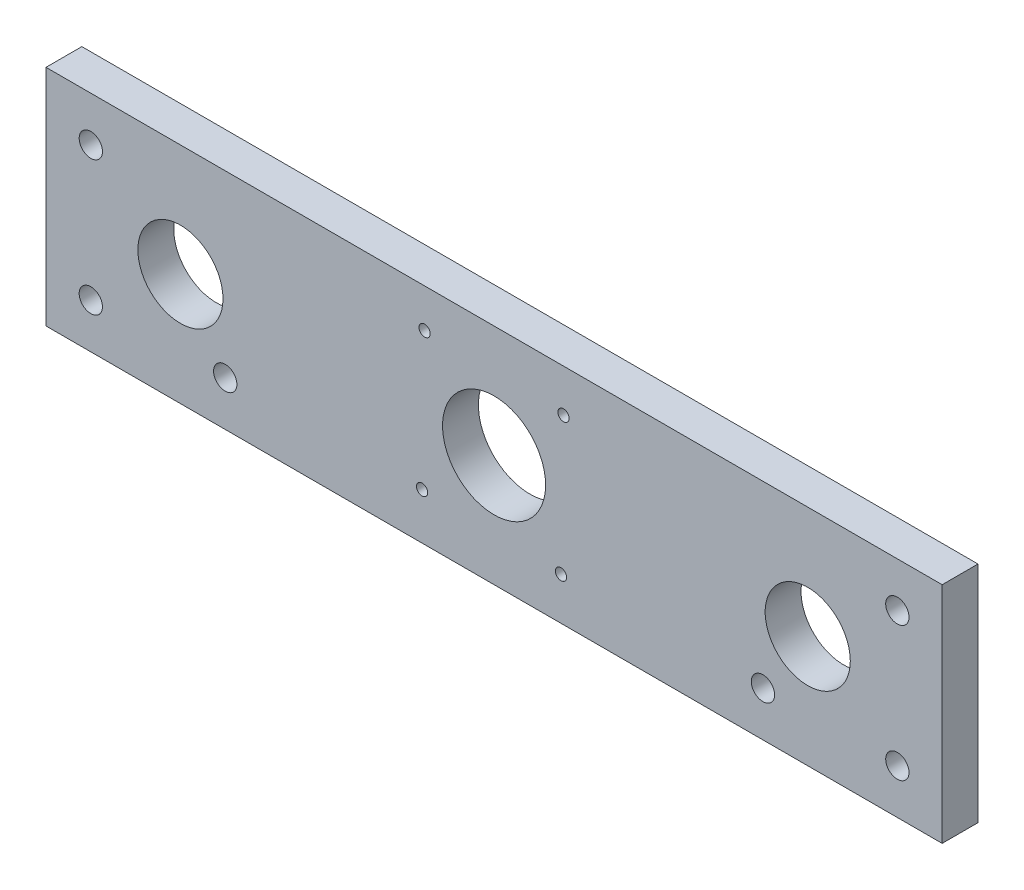
ISO-10303-21;
HEADER;
FILE_DESCRIPTION(('STEP AP214'),'2;1');
FILE_NAME('part.step','',(''),(''),'','','');
FILE_SCHEMA(('AUTOMOTIVE_DESIGN { 1 0 10303 214 1 1 1 1 }'));
ENDSEC;
DATA;
#1=APPLICATION_CONTEXT('core data for automotive mechanical design processes');
#2=APPLICATION_PROTOCOL_DEFINITION('international standard','automotive_design',2000,#1);
#3=PRODUCT_CONTEXT('',#1,'mechanical');
#4=PRODUCT('Part','Part','',(#3));
#5=PRODUCT_RELATED_PRODUCT_CATEGORY('part','',(#4));
#6=PRODUCT_DEFINITION_FORMATION('','',#4);
#7=PRODUCT_DEFINITION_CONTEXT('part definition',#1,'design');
#8=PRODUCT_DEFINITION('design','',#6,#7);
#9=PRODUCT_DEFINITION_SHAPE('','',#8);
#10=(LENGTH_UNIT() NAMED_UNIT(*) SI_UNIT(.MILLI.,.METRE.));
#11=(NAMED_UNIT(*) PLANE_ANGLE_UNIT() SI_UNIT($,.RADIAN.));
#12=(NAMED_UNIT(*) SI_UNIT($,.STERADIAN.) SOLID_ANGLE_UNIT());
#13=UNCERTAINTY_MEASURE_WITH_UNIT(LENGTH_MEASURE(1.E-05),#10,'distance_accuracy_value','');
#14=(GEOMETRIC_REPRESENTATION_CONTEXT(3) GLOBAL_UNCERTAINTY_ASSIGNED_CONTEXT((#13)) GLOBAL_UNIT_ASSIGNED_CONTEXT((#10,
#11,#12)) REPRESENTATION_CONTEXT('',''));
#15=CARTESIAN_POINT('',(0.,0.,0.));
#16=DIRECTION('',(0.,0.,1.));
#17=DIRECTION('',(1.,0.,0.));
#18=AXIS2_PLACEMENT_3D('',#15,#16,#17);
#19=CARTESIAN_POINT('',(0.,-1.68869309838472,8.));
#20=DIRECTION('',(0.,1.,0.));
#21=DIRECTION('',(0.,0.,1.));
#22=AXIS2_PLACEMENT_3D('',#19,#20,#21);
#23=PLANE('',#22);
#24=DIRECTION('',(1.,0.,0.));
#25=VECTOR('',#24,1.);
#26=CARTESIAN_POINT('',(0.,-1.68869309838472,0.));
#27=LINE('',#26,#25);
#28=CARTESIAN_POINT('',(-58.1497797356829,-1.68869309838472,0.));
#29=VERTEX_POINT('',#28);
#30=CARTESIAN_POINT('',(141.850220264317,-1.68869309838472,0.));
#31=VERTEX_POINT('',#30);
#32=EDGE_CURVE('E198',#29,#31,#27,.T.);
#33=ORIENTED_EDGE('',*,*,#32,.F.);
#34=DIRECTION('',(0.,0.,-1.));
#35=VECTOR('',#34,1.);
#36=CARTESIAN_POINT('',(-58.1497797356829,-1.68869309838472,8.));
#37=LINE('',#36,#35);
#38=CARTESIAN_POINT('',(-58.1497797356829,-1.68869309838472,8.));
#39=VERTEX_POINT('',#38);
#40=EDGE_CURVE('E11',#39,#29,#37,.T.);
#41=ORIENTED_EDGE('',*,*,#40,.F.);
#42=DIRECTION('',(1.,0.,0.));
#43=VECTOR('',#42,1.);
#44=CARTESIAN_POINT('',(0.,-1.68869309838472,8.));
#45=LINE('',#44,#43);
#46=CARTESIAN_POINT('',(141.850220264317,-1.68869309838472,8.));
#47=VERTEX_POINT('',#46);
#48=EDGE_CURVE('E100',#39,#47,#45,.T.);
#49=ORIENTED_EDGE('',*,*,#48,.T.);
#50=DIRECTION('',(0.,0.,-1.));
#51=VECTOR('',#50,1.);
#52=CARTESIAN_POINT('',(141.850220264317,-1.68869309838472,8.));
#53=LINE('',#52,#51);
#54=EDGE_CURVE('E60',#47,#31,#53,.T.);
#55=ORIENTED_EDGE('',*,*,#54,.T.);
#56=EDGE_LOOP('',(#33,#41,#49,#55));
#57=FACE_BOUND('',#56,.T.);
#58=ADVANCED_FACE('F40',(#57),#23,.T.);
#59=CARTESIAN_POINT('',(-58.1497797356829,0.,8.));
#60=DIRECTION('',(1.,0.,0.));
#61=DIRECTION('',(0.,1.,0.));
#62=AXIS2_PLACEMENT_3D('',#59,#60,#61);
#63=PLANE('',#62);
#64=DIRECTION('',(0.,-1.,0.));
#65=VECTOR('',#64,1.);
#66=CARTESIAN_POINT('',(-58.1497797356829,0.,0.));
#67=LINE('',#66,#65);
#68=CARTESIAN_POINT('',(-58.1497797356828,-51.6886930983847,0.));
#69=VERTEX_POINT('',#68);
#70=EDGE_CURVE('E106',#29,#69,#67,.T.);
#71=ORIENTED_EDGE('',*,*,#70,.T.);
#72=DIRECTION('',(0.,0.,-1.));
#73=VECTOR('',#72,1.);
#74=CARTESIAN_POINT('',(-58.1497797356828,-51.6886930983847,8.));
#75=LINE('',#74,#73);
#76=CARTESIAN_POINT('',(-58.1497797356828,-51.6886930983847,8.));
#77=VERTEX_POINT('',#76);
#78=EDGE_CURVE('E51',#77,#69,#75,.T.);
#79=ORIENTED_EDGE('',*,*,#78,.F.);
#80=DIRECTION('',(0.,-1.,0.));
#81=VECTOR('',#80,1.);
#82=CARTESIAN_POINT('',(-58.1497797356829,0.,8.));
#83=LINE('',#82,#81);
#84=EDGE_CURVE('E95',#39,#77,#83,.T.);
#85=ORIENTED_EDGE('',*,*,#84,.F.);
#86=ORIENTED_EDGE('',*,*,#40,.T.);
#87=EDGE_LOOP('',(#71,#79,#85,#86));
#88=FACE_BOUND('',#87,.T.);
#89=ADVANCED_FACE('F104',(#88),#63,.F.);
#90=CARTESIAN_POINT('',(0.,-51.6886930983847,8.));
#91=DIRECTION('',(0.,1.,0.));
#92=DIRECTION('',(0.,0.,1.));
#93=AXIS2_PLACEMENT_3D('',#90,#91,#92);
#94=PLANE('',#93);
#95=DIRECTION('',(1.,0.,0.));
#96=VECTOR('',#95,1.);
#97=CARTESIAN_POINT('',(0.,-51.6886930983847,0.));
#98=LINE('',#97,#96);
#99=CARTESIAN_POINT('',(141.850220264317,-51.6886930983847,0.));
#100=VERTEX_POINT('',#99);
#101=EDGE_CURVE('E203',#69,#100,#98,.T.);
#102=ORIENTED_EDGE('',*,*,#101,.T.);
#103=DIRECTION('',(0.,0.,-1.));
#104=VECTOR('',#103,1.);
#105=CARTESIAN_POINT('',(141.850220264317,-51.6886930983847,8.));
#106=LINE('',#105,#104);
#107=CARTESIAN_POINT('',(141.850220264317,-51.6886930983847,8.));
#108=VERTEX_POINT('',#107);
#109=EDGE_CURVE('E74',#108,#100,#106,.T.);
#110=ORIENTED_EDGE('',*,*,#109,.F.);
#111=DIRECTION('',(1.,0.,0.));
#112=VECTOR('',#111,1.);
#113=CARTESIAN_POINT('',(0.,-51.6886930983847,8.));
#114=LINE('',#113,#112);
#115=EDGE_CURVE('E86',#77,#108,#114,.T.);
#116=ORIENTED_EDGE('',*,*,#115,.F.);
#117=ORIENTED_EDGE('',*,*,#78,.T.);
#118=EDGE_LOOP('',(#102,#110,#116,#117));
#119=FACE_BOUND('',#118,.T.);
#120=ADVANCED_FACE('F88',(#119),#94,.F.);
#121=CARTESIAN_POINT('',(141.850220264317,0.,8.));
#122=DIRECTION('',(1.,0.,0.));
#123=DIRECTION('',(0.,0.,-1.));
#124=AXIS2_PLACEMENT_3D('',#121,#122,#123);
#125=PLANE('',#124);
#126=DIRECTION('',(0.,-1.,0.));
#127=VECTOR('',#126,1.);
#128=CARTESIAN_POINT('',(141.850220264317,0.,0.));
#129=LINE('',#128,#127);
#130=EDGE_CURVE('E206',#31,#100,#129,.T.);
#131=ORIENTED_EDGE('',*,*,#130,.F.);
#132=ORIENTED_EDGE('',*,*,#54,.F.);
#133=DIRECTION('',(0.,-1.,0.));
#134=VECTOR('',#133,1.);
#135=CARTESIAN_POINT('',(141.850220264317,0.,8.));
#136=LINE('',#135,#134);
#137=EDGE_CURVE('E94',#47,#108,#136,.T.);
#138=ORIENTED_EDGE('',*,*,#137,.T.);
#139=ORIENTED_EDGE('',*,*,#109,.T.);
#140=EDGE_LOOP('',(#131,#132,#138,#139));
#141=FACE_BOUND('',#140,.T.);
#142=ADVANCED_FACE('F256',(#141),#125,.T.);
#143=CARTESIAN_POINT('',(111.850220264317,-26.6886930983847,8.));
#144=DIRECTION('',(0.,0.,-1.));
#145=DIRECTION('',(-1.,0.,0.));
#146=AXIS2_PLACEMENT_3D('',#143,#144,#145);
#147=CYLINDRICAL_SURFACE('',#146,9.49999999999999);
#148=CARTESIAN_POINT('',(111.850220264317,-26.6886930983847,8.));
#149=DIRECTION('',(0.,0.,1.));
#150=DIRECTION('',(1.,0.,0.));
#151=AXIS2_PLACEMENT_3D('',#148,#149,#150);
#152=CIRCLE('',#151,9.49999999999999);
#153=CARTESIAN_POINT('',(121.350220264317,-26.6886930983847,8.));
#154=VERTEX_POINT('',#153);
#155=EDGE_CURVE('E182',#154,#154,#152,.T.);
#156=ORIENTED_EDGE('',*,*,#155,.T.);
#157=EDGE_LOOP('',(#156));
#158=FACE_BOUND('',#157,.T.);
#159=CARTESIAN_POINT('',(111.850220264317,-26.6886930983847,0.));
#160=DIRECTION('',(0.,0.,1.));
#161=DIRECTION('',(1.,0.,0.));
#162=AXIS2_PLACEMENT_3D('',#159,#160,#161);
#163=CIRCLE('',#162,9.49999999999999);
#164=CARTESIAN_POINT('',(121.350220264317,-26.6886930983847,0.));
#165=VERTEX_POINT('',#164);
#166=EDGE_CURVE('E181',#165,#165,#163,.T.);
#167=ORIENTED_EDGE('',*,*,#166,.F.);
#168=EDGE_LOOP('',(#167));
#169=FACE_BOUND('',#168,.T.);
#170=ADVANCED_FACE('F42',(#158,#169),#147,.F.);
#171=CARTESIAN_POINT('',(-28.1497797356829,-26.6886930983847,8.));
#172=DIRECTION('',(0.,0.,-1.));
#173=DIRECTION('',(-1.,0.,0.));
#174=AXIS2_PLACEMENT_3D('',#171,#172,#173);
#175=CYLINDRICAL_SURFACE('',#174,9.5);
#176=CARTESIAN_POINT('',(-28.1497797356829,-26.6886930983847,8.));
#177=DIRECTION('',(0.,0.,1.));
#178=DIRECTION('',(1.,0.,0.));
#179=AXIS2_PLACEMENT_3D('',#176,#177,#178);
#180=CIRCLE('',#179,9.5);
#181=CARTESIAN_POINT('',(-18.6497797356829,-26.6886930983847,8.));
#182=VERTEX_POINT('',#181);
#183=EDGE_CURVE('E191',#182,#182,#180,.T.);
#184=ORIENTED_EDGE('',*,*,#183,.T.);
#185=EDGE_LOOP('',(#184));
#186=FACE_BOUND('',#185,.T.);
#187=CARTESIAN_POINT('',(-28.1497797356829,-26.6886930983847,0.));
#188=DIRECTION('',(0.,0.,1.));
#189=DIRECTION('',(1.,0.,0.));
#190=AXIS2_PLACEMENT_3D('',#187,#188,#189);
#191=CIRCLE('',#190,9.5);
#192=CARTESIAN_POINT('',(-18.6497797356829,-26.6886930983847,0.));
#193=VERTEX_POINT('',#192);
#194=EDGE_CURVE('E186',#193,#193,#191,.T.);
#195=ORIENTED_EDGE('',*,*,#194,.F.);
#196=EDGE_LOOP('',(#195));
#197=FACE_BOUND('',#196,.T.);
#198=ADVANCED_FACE('F245',(#186,#197),#175,.F.);
#199=CARTESIAN_POINT('',(0.,0.,8.));
#200=DIRECTION('',(0.,0.,1.));
#201=DIRECTION('',(1.,0.,0.));
#202=AXIS2_PLACEMENT_3D('',#199,#200,#201);
#203=PLANE('',#202);
#204=CARTESIAN_POINT('',(-18.1497797356829,-41.6886930983847,8.));
#205=DIRECTION('',(0.,0.,1.));
#206=DIRECTION('',(1.,0.,0.));
#207=AXIS2_PLACEMENT_3D('',#204,#205,#206);
#208=CIRCLE('',#207,2.59999999999999);
#209=CARTESIAN_POINT('',(-15.5497797356829,-41.6886930983847,8.));
#210=VERTEX_POINT('',#209);
#211=EDGE_CURVE('E405',#210,#210,#208,.T.);
#212=ORIENTED_EDGE('',*,*,#211,.F.);
#213=EDGE_LOOP('',(#212));
#214=FACE_BOUND('',#213,.T.);
#215=CARTESIAN_POINT('',(101.850220264317,-41.6886930983847,8.));
#216=DIRECTION('',(0.,0.,1.));
#217=DIRECTION('',(1.,0.,0.));
#218=AXIS2_PLACEMENT_3D('',#215,#216,#217);
#219=CIRCLE('',#218,2.59999999999999);
#220=CARTESIAN_POINT('',(104.450220264317,-41.6886930983847,8.));
#221=VERTEX_POINT('',#220);
#222=EDGE_CURVE('E409',#221,#221,#219,.T.);
#223=ORIENTED_EDGE('',*,*,#222,.F.);
#224=EDGE_LOOP('',(#223));
#225=FACE_BOUND('',#224,.T.);
#226=CARTESIAN_POINT('',(26.3502202643171,-10.3290102578117,8.));
#227=DIRECTION('',(0.,0.,1.));
#228=DIRECTION('',(1.,0.,0.));
#229=AXIS2_PLACEMENT_3D('',#226,#227,#228);
#230=CIRCLE('',#229,1.25);
#231=CARTESIAN_POINT('',(27.6002202643171,-10.3290102578117,8.));
#232=VERTEX_POINT('',#231);
#233=EDGE_CURVE('E145',#232,#232,#230,.F.);
#234=ORIENTED_EDGE('',*,*,#233,.T.);
#235=EDGE_LOOP('',(#234));
#236=FACE_BOUND('',#235,.T.);
#237=CARTESIAN_POINT('',(25.781535145797,-41.3290102578117,8.));
#238=DIRECTION('',(0.,0.,1.));
#239=DIRECTION('',(1.,0.,0.));
#240=AXIS2_PLACEMENT_3D('',#237,#238,#239);
#241=CIRCLE('',#240,1.24999999999999);
#242=CARTESIAN_POINT('',(27.0315351457969,-41.3290102578117,8.));
#243=VERTEX_POINT('',#242);
#244=EDGE_CURVE('E131',#243,#243,#241,.F.);
#245=ORIENTED_EDGE('',*,*,#244,.T.);
#246=EDGE_LOOP('',(#245));
#247=FACE_BOUND('',#246,.T.);
#248=CARTESIAN_POINT('',(56.781535145797,-42.1886930983847,8.));
#249=DIRECTION('',(0.,0.,1.));
#250=DIRECTION('',(1.,0.,0.));
#251=AXIS2_PLACEMENT_3D('',#248,#249,#250);
#252=CIRCLE('',#251,1.25);
#253=CARTESIAN_POINT('',(58.031535145797,-42.1886930983847,8.));
#254=VERTEX_POINT('',#253);
#255=EDGE_CURVE('E127',#254,#254,#252,.F.);
#256=ORIENTED_EDGE('',*,*,#255,.T.);
#257=EDGE_LOOP('',(#256));
#258=FACE_BOUND('',#257,.T.);
#259=CARTESIAN_POINT('',(57.3502202643171,-11.1886930983847,8.));
#260=DIRECTION('',(0.,0.,1.));
#261=DIRECTION('',(1.,0.,0.));
#262=AXIS2_PLACEMENT_3D('',#259,#260,#261);
#263=CIRCLE('',#262,1.24999999999999);
#264=CARTESIAN_POINT('',(58.6002202643171,-11.1886930983847,8.));
#265=VERTEX_POINT('',#264);
#266=EDGE_CURVE('E123',#265,#265,#263,.F.);
#267=ORIENTED_EDGE('',*,*,#266,.T.);
#268=EDGE_LOOP('',(#267));
#269=FACE_BOUND('',#268,.T.);
#270=CARTESIAN_POINT('',(41.8502202643171,-26.6886930983847,8.));
#271=DIRECTION('',(0.,0.,1.));
#272=DIRECTION('',(1.,0.,0.));
#273=AXIS2_PLACEMENT_3D('',#270,#271,#272);
#274=CIRCLE('',#273,11.5);
#275=CARTESIAN_POINT('',(53.3502202643171,-26.6886930983847,8.));
#276=VERTEX_POINT('',#275);
#277=EDGE_CURVE('E117',#276,#276,#274,.F.);
#278=ORIENTED_EDGE('',*,*,#277,.T.);
#279=EDGE_LOOP('',(#278));
#280=FACE_BOUND('',#279,.T.);
#281=CARTESIAN_POINT('',(-48.1497797356828,-11.6886930983847,8.));
#282=DIRECTION('',(0.,0.,1.));
#283=DIRECTION('',(1.,0.,0.));
#284=AXIS2_PLACEMENT_3D('',#281,#282,#283);
#285=CIRCLE('',#284,2.59999999999999);
#286=CARTESIAN_POINT('',(-45.5497797356829,-11.6886930983847,8.));
#287=VERTEX_POINT('',#286);
#288=EDGE_CURVE('E149',#287,#287,#285,.T.);
#289=ORIENTED_EDGE('',*,*,#288,.F.);
#290=EDGE_LOOP('',(#289));
#291=FACE_BOUND('',#290,.T.);
#292=CARTESIAN_POINT('',(-48.1497797356828,-41.6886930983847,8.));
#293=DIRECTION('',(0.,0.,1.));
#294=DIRECTION('',(1.,0.,0.));
#295=AXIS2_PLACEMENT_3D('',#292,#293,#294);
#296=CIRCLE('',#295,2.59999999999998);
#297=CARTESIAN_POINT('',(-45.5497797356829,-41.6886930983847,8.));
#298=VERTEX_POINT('',#297);
#299=EDGE_CURVE('E157',#298,#298,#296,.T.);
#300=ORIENTED_EDGE('',*,*,#299,.F.);
#301=EDGE_LOOP('',(#300));
#302=FACE_BOUND('',#301,.T.);
#303=CARTESIAN_POINT('',(131.850220264317,-41.6886930983847,8.));
#304=DIRECTION('',(0.,0.,1.));
#305=DIRECTION('',(1.,0.,0.));
#306=AXIS2_PLACEMENT_3D('',#303,#304,#305);
#307=CIRCLE('',#306,2.59999999999999);
#308=CARTESIAN_POINT('',(134.450220264317,-41.6886930983847,8.));
#309=VERTEX_POINT('',#308);
#310=EDGE_CURVE('E165',#309,#309,#307,.T.);
#311=ORIENTED_EDGE('',*,*,#310,.F.);
#312=EDGE_LOOP('',(#311));
#313=FACE_BOUND('',#312,.T.);
#314=CARTESIAN_POINT('',(131.850220264317,-11.6886930983847,8.));
#315=DIRECTION('',(0.,0.,1.));
#316=DIRECTION('',(1.,0.,0.));
#317=AXIS2_PLACEMENT_3D('',#314,#315,#316);
#318=CIRCLE('',#317,2.59999999999999);
#319=CARTESIAN_POINT('',(134.450220264317,-11.6886930983847,8.));
#320=VERTEX_POINT('',#319);
#321=EDGE_CURVE('E173',#320,#320,#318,.T.);
#322=ORIENTED_EDGE('',*,*,#321,.F.);
#323=EDGE_LOOP('',(#322));
#324=FACE_BOUND('',#323,.T.);
#325=ORIENTED_EDGE('',*,*,#155,.F.);
#326=EDGE_LOOP('',(#325));
#327=FACE_BOUND('',#326,.T.);
#328=ORIENTED_EDGE('',*,*,#48,.F.);
#329=ORIENTED_EDGE('',*,*,#84,.T.);
#330=ORIENTED_EDGE('',*,*,#115,.T.);
#331=ORIENTED_EDGE('',*,*,#137,.F.);
#332=EDGE_LOOP('',(#328,#329,#330,#331));
#333=FACE_BOUND('',#332,.T.);
#334=ORIENTED_EDGE('',*,*,#183,.F.);
#335=EDGE_LOOP('',(#334));
#336=FACE_BOUND('',#335,.T.);
#337=ADVANCED_FACE('F98',(#214,#225,#236,#247,#258,#269,#280,#291,#302,#313,#324,#327,#333,
#336),#203,.T.);
#338=CARTESIAN_POINT('',(0.,0.,0.));
#339=DIRECTION('',(0.,0.,1.));
#340=DIRECTION('',(1.,0.,0.));
#341=AXIS2_PLACEMENT_3D('',#338,#339,#340);
#342=PLANE('',#341);
#343=CARTESIAN_POINT('',(-18.1497797356829,-41.6886930983847,0.));
#344=DIRECTION('',(0.,0.,1.));
#345=DIRECTION('',(1.,0.,0.));
#346=AXIS2_PLACEMENT_3D('',#343,#344,#345);
#347=CIRCLE('',#346,2.59999999999999);
#348=CARTESIAN_POINT('',(-15.5497797356829,-41.6886930983847,0.));
#349=VERTEX_POINT('',#348);
#350=EDGE_CURVE('E402',#349,#349,#347,.T.);
#351=ORIENTED_EDGE('',*,*,#350,.T.);
#352=EDGE_LOOP('',(#351));
#353=FACE_BOUND('',#352,.T.);
#354=CARTESIAN_POINT('',(101.850220264317,-41.6886930983847,0.));
#355=DIRECTION('',(0.,0.,1.));
#356=DIRECTION('',(1.,0.,0.));
#357=AXIS2_PLACEMENT_3D('',#354,#355,#356);
#358=CIRCLE('',#357,2.6);
#359=CARTESIAN_POINT('',(104.450220264317,-41.6886930983847,0.));
#360=VERTEX_POINT('',#359);
#361=EDGE_CURVE('E118',#360,#360,#358,.T.);
#362=ORIENTED_EDGE('',*,*,#361,.T.);
#363=EDGE_LOOP('',(#362));
#364=FACE_BOUND('',#363,.T.);
#365=CARTESIAN_POINT('',(26.3502202643171,-10.3290102578117,0.));
#366=DIRECTION('',(0.,0.,1.));
#367=DIRECTION('',(1.,0.,0.));
#368=AXIS2_PLACEMENT_3D('',#365,#366,#367);
#369=CIRCLE('',#368,1.25);
#370=CARTESIAN_POINT('',(27.6002202643171,-10.3290102578117,0.));
#371=VERTEX_POINT('',#370);
#372=EDGE_CURVE('E44',#371,#371,#369,.F.);
#373=ORIENTED_EDGE('',*,*,#372,.F.);
#374=EDGE_LOOP('',(#373));
#375=FACE_BOUND('',#374,.T.);
#376=CARTESIAN_POINT('',(25.781535145797,-41.3290102578117,0.));
#377=DIRECTION('',(0.,0.,1.));
#378=DIRECTION('',(1.,0.,0.));
#379=AXIS2_PLACEMENT_3D('',#376,#377,#378);
#380=CIRCLE('',#379,1.24999999999999);
#381=CARTESIAN_POINT('',(27.0315351457969,-41.3290102578117,0.));
#382=VERTEX_POINT('',#381);
#383=EDGE_CURVE('E128',#382,#382,#380,.F.);
#384=ORIENTED_EDGE('',*,*,#383,.F.);
#385=EDGE_LOOP('',(#384));
#386=FACE_BOUND('',#385,.T.);
#387=CARTESIAN_POINT('',(56.781535145797,-42.1886930983847,0.));
#388=DIRECTION('',(0.,0.,1.));
#389=DIRECTION('',(1.,0.,0.));
#390=AXIS2_PLACEMENT_3D('',#387,#388,#389);
#391=CIRCLE('',#390,1.25);
#392=CARTESIAN_POINT('',(58.031535145797,-42.1886930983847,0.));
#393=VERTEX_POINT('',#392);
#394=EDGE_CURVE('E124',#393,#393,#391,.F.);
#395=ORIENTED_EDGE('',*,*,#394,.F.);
#396=EDGE_LOOP('',(#395));
#397=FACE_BOUND('',#396,.T.);
#398=CARTESIAN_POINT('',(57.3502202643171,-11.1886930983847,0.));
#399=DIRECTION('',(0.,0.,1.));
#400=DIRECTION('',(1.,0.,0.));
#401=AXIS2_PLACEMENT_3D('',#398,#399,#400);
#402=CIRCLE('',#401,1.24999999999999);
#403=CARTESIAN_POINT('',(58.6002202643171,-11.1886930983847,0.));
#404=VERTEX_POINT('',#403);
#405=EDGE_CURVE('E119',#404,#404,#402,.F.);
#406=ORIENTED_EDGE('',*,*,#405,.F.);
#407=EDGE_LOOP('',(#406));
#408=FACE_BOUND('',#407,.T.);
#409=CARTESIAN_POINT('',(41.8502202643171,-26.6886930983847,0.));
#410=DIRECTION('',(0.,0.,1.));
#411=DIRECTION('',(1.,0.,0.));
#412=AXIS2_PLACEMENT_3D('',#409,#410,#411);
#413=CIRCLE('',#412,11.5);
#414=CARTESIAN_POINT('',(53.3502202643171,-26.6886930983847,0.));
#415=VERTEX_POINT('',#414);
#416=EDGE_CURVE('E113',#415,#415,#413,.F.);
#417=ORIENTED_EDGE('',*,*,#416,.F.);
#418=EDGE_LOOP('',(#417));
#419=FACE_BOUND('',#418,.T.);
#420=CARTESIAN_POINT('',(-48.1497797356828,-11.6886930983847,0.));
#421=DIRECTION('',(0.,0.,1.));
#422=DIRECTION('',(1.,0.,0.));
#423=AXIS2_PLACEMENT_3D('',#420,#421,#422);
#424=CIRCLE('',#423,2.59999999999999);
#425=CARTESIAN_POINT('',(-45.5497797356829,-11.6886930983847,0.));
#426=VERTEX_POINT('',#425);
#427=EDGE_CURVE('E153',#426,#426,#424,.T.);
#428=ORIENTED_EDGE('',*,*,#427,.T.);
#429=EDGE_LOOP('',(#428));
#430=FACE_BOUND('',#429,.T.);
#431=CARTESIAN_POINT('',(-48.1497797356828,-41.6886930983847,0.));
#432=DIRECTION('',(0.,0.,1.));
#433=DIRECTION('',(1.,0.,0.));
#434=AXIS2_PLACEMENT_3D('',#431,#432,#433);
#435=CIRCLE('',#434,2.59999999999999);
#436=CARTESIAN_POINT('',(-45.5497797356829,-41.6886930983847,0.));
#437=VERTEX_POINT('',#436);
#438=EDGE_CURVE('E161',#437,#437,#435,.T.);
#439=ORIENTED_EDGE('',*,*,#438,.T.);
#440=EDGE_LOOP('',(#439));
#441=FACE_BOUND('',#440,.T.);
#442=CARTESIAN_POINT('',(131.850220264317,-41.6886930983847,0.));
#443=DIRECTION('',(0.,0.,1.));
#444=DIRECTION('',(1.,0.,0.));
#445=AXIS2_PLACEMENT_3D('',#442,#443,#444);
#446=CIRCLE('',#445,2.59999999999999);
#447=CARTESIAN_POINT('',(134.450220264317,-41.6886930983847,0.));
#448=VERTEX_POINT('',#447);
#449=EDGE_CURVE('E169',#448,#448,#446,.T.);
#450=ORIENTED_EDGE('',*,*,#449,.T.);
#451=EDGE_LOOP('',(#450));
#452=FACE_BOUND('',#451,.T.);
#453=CARTESIAN_POINT('',(131.850220264317,-11.6886930983847,0.));
#454=DIRECTION('',(0.,0.,1.));
#455=DIRECTION('',(1.,0.,0.));
#456=AXIS2_PLACEMENT_3D('',#453,#454,#455);
#457=CIRCLE('',#456,2.59999999999999);
#458=CARTESIAN_POINT('',(134.450220264317,-11.6886930983847,0.));
#459=VERTEX_POINT('',#458);
#460=EDGE_CURVE('E177',#459,#459,#457,.T.);
#461=ORIENTED_EDGE('',*,*,#460,.T.);
#462=EDGE_LOOP('',(#461));
#463=FACE_BOUND('',#462,.T.);
#464=ORIENTED_EDGE('',*,*,#166,.T.);
#465=EDGE_LOOP('',(#464));
#466=FACE_BOUND('',#465,.T.);
#467=ORIENTED_EDGE('',*,*,#32,.T.);
#468=ORIENTED_EDGE('',*,*,#130,.T.);
#469=ORIENTED_EDGE('',*,*,#101,.F.);
#470=ORIENTED_EDGE('',*,*,#70,.F.);
#471=EDGE_LOOP('',(#467,#468,#469,#470));
#472=FACE_BOUND('',#471,.T.);
#473=ORIENTED_EDGE('',*,*,#194,.T.);
#474=EDGE_LOOP('',(#473));
#475=FACE_BOUND('',#474,.T.);
#476=ADVANCED_FACE('F219',(#353,#364,#375,#386,#397,#408,#419,#430,#441,#452,#463,#466,#472,
#475),#342,.F.);
#477=CARTESIAN_POINT('',(131.850220264317,-11.6886930983847,8.));
#478=DIRECTION('',(0.,0.,1.));
#479=DIRECTION('',(1.,0.,0.));
#480=AXIS2_PLACEMENT_3D('',#477,#478,#479);
#481=CYLINDRICAL_SURFACE('',#480,2.59999999999999);
#482=ORIENTED_EDGE('',*,*,#460,.F.);
#483=EDGE_LOOP('',(#482));
#484=FACE_BOUND('',#483,.T.);
#485=ORIENTED_EDGE('',*,*,#321,.T.);
#486=EDGE_LOOP('',(#485));
#487=FACE_BOUND('',#486,.T.);
#488=ADVANCED_FACE('F222',(#484,#487),#481,.F.);
#489=CARTESIAN_POINT('',(131.850220264317,-41.6886930983847,8.));
#490=DIRECTION('',(0.,0.,1.));
#491=DIRECTION('',(1.,0.,0.));
#492=AXIS2_PLACEMENT_3D('',#489,#490,#491);
#493=CYLINDRICAL_SURFACE('',#492,2.59999999999999);
#494=ORIENTED_EDGE('',*,*,#449,.F.);
#495=EDGE_LOOP('',(#494));
#496=FACE_BOUND('',#495,.T.);
#497=ORIENTED_EDGE('',*,*,#310,.T.);
#498=EDGE_LOOP('',(#497));
#499=FACE_BOUND('',#498,.T.);
#500=ADVANCED_FACE('F289',(#496,#499),#493,.F.);
#501=CARTESIAN_POINT('',(-48.1497797356828,-41.6886930983847,8.));
#502=DIRECTION('',(0.,0.,1.));
#503=DIRECTION('',(1.,0.,0.));
#504=AXIS2_PLACEMENT_3D('',#501,#502,#503);
#505=CYLINDRICAL_SURFACE('',#504,2.59999999999999);
#506=ORIENTED_EDGE('',*,*,#438,.F.);
#507=EDGE_LOOP('',(#506));
#508=FACE_BOUND('',#507,.T.);
#509=ORIENTED_EDGE('',*,*,#299,.T.);
#510=EDGE_LOOP('',(#509));
#511=FACE_BOUND('',#510,.T.);
#512=ADVANCED_FACE('F301',(#508,#511),#505,.F.);
#513=CARTESIAN_POINT('',(-48.1497797356828,-11.6886930983847,8.));
#514=DIRECTION('',(0.,0.,1.));
#515=DIRECTION('',(1.,0.,0.));
#516=AXIS2_PLACEMENT_3D('',#513,#514,#515);
#517=CYLINDRICAL_SURFACE('',#516,2.59999999999999);
#518=ORIENTED_EDGE('',*,*,#427,.F.);
#519=EDGE_LOOP('',(#518));
#520=FACE_BOUND('',#519,.T.);
#521=ORIENTED_EDGE('',*,*,#288,.T.);
#522=EDGE_LOOP('',(#521));
#523=FACE_BOUND('',#522,.T.);
#524=ADVANCED_FACE('F311',(#520,#523),#517,.F.);
#525=CARTESIAN_POINT('',(41.8502202643171,-26.6886930983847,-10.));
#526=DIRECTION('',(0.,0.,1.));
#527=DIRECTION('',(1.,0.,0.));
#528=AXIS2_PLACEMENT_3D('',#525,#526,#527);
#529=CYLINDRICAL_SURFACE('',#528,11.5);
#530=ORIENTED_EDGE('',*,*,#277,.F.);
#531=EDGE_LOOP('',(#530));
#532=FACE_BOUND('',#531,.T.);
#533=ORIENTED_EDGE('',*,*,#416,.T.);
#534=EDGE_LOOP('',(#533));
#535=FACE_BOUND('',#534,.T.);
#536=ADVANCED_FACE('F321',(#532,#535),#529,.F.);
#537=CARTESIAN_POINT('',(57.3502202643171,-11.1886930983847,-10.));
#538=DIRECTION('',(0.,0.,1.));
#539=DIRECTION('',(1.,0.,0.));
#540=AXIS2_PLACEMENT_3D('',#537,#538,#539);
#541=CYLINDRICAL_SURFACE('',#540,1.24999999999999);
#542=ORIENTED_EDGE('',*,*,#266,.F.);
#543=EDGE_LOOP('',(#542));
#544=FACE_BOUND('',#543,.T.);
#545=ORIENTED_EDGE('',*,*,#405,.T.);
#546=EDGE_LOOP('',(#545));
#547=FACE_BOUND('',#546,.T.);
#548=ADVANCED_FACE('F331',(#544,#547),#541,.F.);
#549=CARTESIAN_POINT('',(56.781535145797,-42.1886930983847,-10.));
#550=DIRECTION('',(0.,0.,1.));
#551=DIRECTION('',(1.,0.,0.));
#552=AXIS2_PLACEMENT_3D('',#549,#550,#551);
#553=CYLINDRICAL_SURFACE('',#552,1.25);
#554=ORIENTED_EDGE('',*,*,#255,.F.);
#555=EDGE_LOOP('',(#554));
#556=FACE_BOUND('',#555,.T.);
#557=ORIENTED_EDGE('',*,*,#394,.T.);
#558=EDGE_LOOP('',(#557));
#559=FACE_BOUND('',#558,.T.);
#560=ADVANCED_FACE('F341',(#556,#559),#553,.F.);
#561=CARTESIAN_POINT('',(25.781535145797,-41.3290102578117,-10.));
#562=DIRECTION('',(0.,0.,1.));
#563=DIRECTION('',(1.,0.,0.));
#564=AXIS2_PLACEMENT_3D('',#561,#562,#563);
#565=CYLINDRICAL_SURFACE('',#564,1.24999999999999);
#566=ORIENTED_EDGE('',*,*,#244,.F.);
#567=EDGE_LOOP('',(#566));
#568=FACE_BOUND('',#567,.T.);
#569=ORIENTED_EDGE('',*,*,#383,.T.);
#570=EDGE_LOOP('',(#569));
#571=FACE_BOUND('',#570,.T.);
#572=ADVANCED_FACE('F351',(#568,#571),#565,.F.);
#573=CARTESIAN_POINT('',(26.3502202643171,-10.3290102578117,-10.));
#574=DIRECTION('',(0.,0.,1.));
#575=DIRECTION('',(1.,0.,0.));
#576=AXIS2_PLACEMENT_3D('',#573,#574,#575);
#577=CYLINDRICAL_SURFACE('',#576,1.25);
#578=ORIENTED_EDGE('',*,*,#233,.F.);
#579=EDGE_LOOP('',(#578));
#580=FACE_BOUND('',#579,.T.);
#581=ORIENTED_EDGE('',*,*,#372,.T.);
#582=EDGE_LOOP('',(#581));
#583=FACE_BOUND('',#582,.T.);
#584=ADVANCED_FACE('F217',(#580,#583),#577,.F.);
#585=CARTESIAN_POINT('',(101.850220264317,-41.6886930983847,8.));
#586=DIRECTION('',(0.,0.,1.));
#587=DIRECTION('',(1.,0.,0.));
#588=AXIS2_PLACEMENT_3D('',#585,#586,#587);
#589=CYLINDRICAL_SURFACE('',#588,2.6);
#590=ORIENTED_EDGE('',*,*,#361,.F.);
#591=EDGE_LOOP('',(#590));
#592=FACE_BOUND('',#591,.T.);
#593=ORIENTED_EDGE('',*,*,#222,.T.);
#594=EDGE_LOOP('',(#593));
#595=FACE_BOUND('',#594,.T.);
#596=ADVANCED_FACE('F369',(#592,#595),#589,.F.);
#597=CARTESIAN_POINT('',(-18.1497797356829,-41.6886930983847,8.));
#598=DIRECTION('',(0.,0.,1.));
#599=DIRECTION('',(1.,0.,0.));
#600=AXIS2_PLACEMENT_3D('',#597,#598,#599);
#601=CYLINDRICAL_SURFACE('',#600,2.59999999999999);
#602=ORIENTED_EDGE('',*,*,#350,.F.);
#603=EDGE_LOOP('',(#602));
#604=FACE_BOUND('',#603,.T.);
#605=ORIENTED_EDGE('',*,*,#211,.T.);
#606=EDGE_LOOP('',(#605));
#607=FACE_BOUND('',#606,.T.);
#608=ADVANCED_FACE('F385',(#604,#607),#601,.F.);
#609=CLOSED_SHELL('',(#58,#89,#120,#142,#170,#198,#337,#476,#488,#500,#512,#524,#536,#548,#560,
#572,#584,#596,#608));
#610=MANIFOLD_SOLID_BREP('B2',#609);
#611=ADVANCED_BREP_SHAPE_REPRESENTATION('',(#18,#610),#14);
#612=SHAPE_DEFINITION_REPRESENTATION(#9,#611);
ENDSEC;
END-ISO-10303-21;
